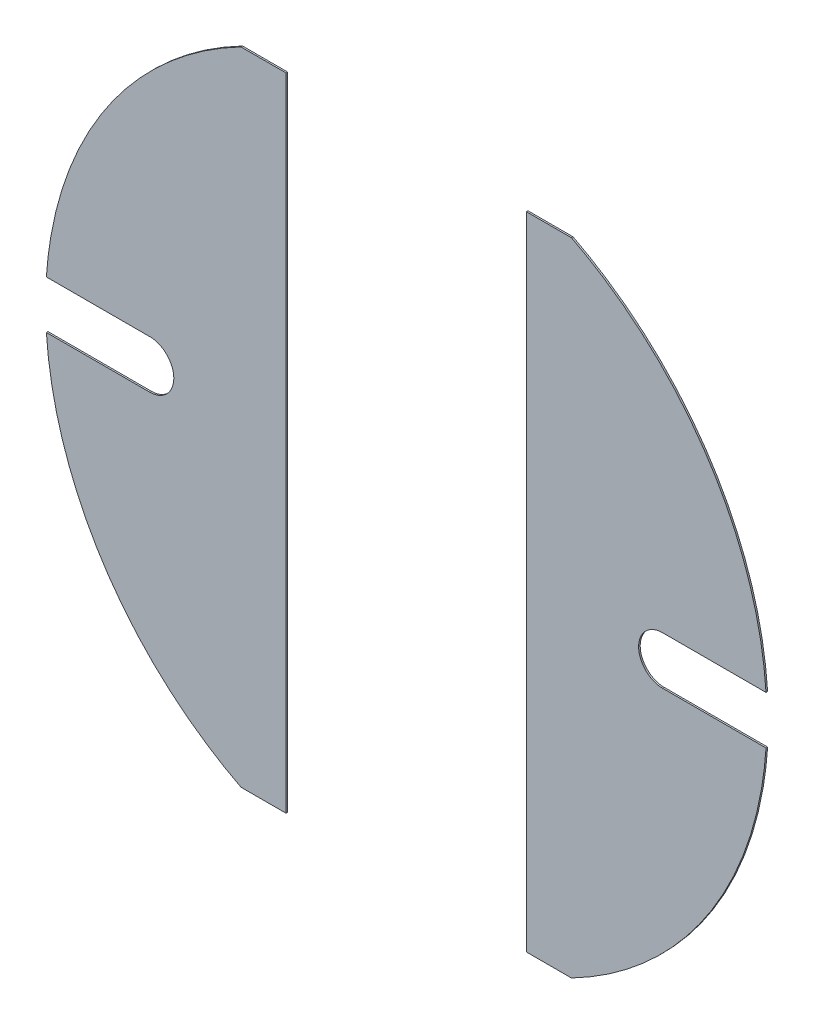
ISO-10303-21;
HEADER;
FILE_DESCRIPTION(('STEP AP214'),'2;1');
FILE_NAME('part.step','',(''),(''),'','','');
FILE_SCHEMA(('AUTOMOTIVE_DESIGN { 1 0 10303 214 1 1 1 1 }'));
ENDSEC;
DATA;
#1=APPLICATION_CONTEXT('core data for automotive mechanical design processes');
#2=APPLICATION_PROTOCOL_DEFINITION('international standard','automotive_design',2000,#1);
#3=PRODUCT_CONTEXT('',#1,'mechanical');
#4=PRODUCT('Part','Part','',(#3));
#5=PRODUCT_RELATED_PRODUCT_CATEGORY('part','',(#4));
#6=PRODUCT_DEFINITION_FORMATION('','',#4);
#7=PRODUCT_DEFINITION_CONTEXT('part definition',#1,'design');
#8=PRODUCT_DEFINITION('design','',#6,#7);
#9=PRODUCT_DEFINITION_SHAPE('','',#8);
#10=(LENGTH_UNIT() NAMED_UNIT(*) SI_UNIT(.MILLI.,.METRE.));
#11=(NAMED_UNIT(*) PLANE_ANGLE_UNIT() SI_UNIT($,.RADIAN.));
#12=(NAMED_UNIT(*) SI_UNIT($,.STERADIAN.) SOLID_ANGLE_UNIT());
#13=UNCERTAINTY_MEASURE_WITH_UNIT(LENGTH_MEASURE(1.E-05),#10,'distance_accuracy_value','');
#14=(GEOMETRIC_REPRESENTATION_CONTEXT(3) GLOBAL_UNCERTAINTY_ASSIGNED_CONTEXT((#13)) GLOBAL_UNIT_ASSIGNED_CONTEXT((#10,
#11,#12)) REPRESENTATION_CONTEXT('',''));
#15=CARTESIAN_POINT('',(0.,0.,0.));
#16=DIRECTION('',(0.,0.,1.));
#17=DIRECTION('',(1.,0.,0.));
#18=AXIS2_PLACEMENT_3D('',#15,#16,#17);
#19=CARTESIAN_POINT('',(0.75,-2.,-0.01));
#20=CARTESIAN_POINT('',(0.75,2.,-0.01));
#21=CARTESIAN_POINT('',(2.244994432064,-2.,-0.01));
#22=CARTESIAN_POINT('',(2.244994432064,2.,-0.01));
#23=(BOUNDED_SURFACE() B_SPLINE_SURFACE(1,1,((#19,#20),(#21,#22)),.UNSPECIFIED.,.F.,.F.,
.F.) B_SPLINE_SURFACE_WITH_KNOTS((2,2),(2,2),(0.75,2.244994432064),(-2.,2.),
.UNSPECIFIED.) GEOMETRIC_REPRESENTATION_ITEM() RATIONAL_B_SPLINE_SURFACE(((1.,1.),(1.,1.))) REPRESENTATION_ITEM('') SURFACE());
#24=CARTESIAN_POINT('',(1.030776406404,-2.,-0.01));
#25=CARTESIAN_POINT('',(0.75,-2.,-0.01));
#26=(BOUNDED_CURVE() B_SPLINE_CURVE(1,(#24,#25),.UNSPECIFIED.,.F.,
.F.) B_SPLINE_CURVE_WITH_KNOTS((2,2),(0.,0.280776406404),
.UNSPECIFIED.) CURVE() GEOMETRIC_REPRESENTATION_ITEM() RATIONAL_B_SPLINE_CURVE((1.,1.)) REPRESENTATION_ITEM(''));
#27=CARTESIAN_POINT('',(1.030776406404,-2.,-0.01));
#28=VERTEX_POINT('',#27);
#29=CARTESIAN_POINT('',(0.75,-2.,-0.01));
#30=VERTEX_POINT('',#29);
#31=EDGE_CURVE('P0_E11',#28,#30,#26,.T.);
#32=CARTESIAN_POINT('',(0.75,-2.,-0.01));
#33=CARTESIAN_POINT('',(0.75,2.,-0.01));
#34=(BOUNDED_CURVE() B_SPLINE_CURVE(1,(#32,#33),.UNSPECIFIED.,.F.,
.F.) B_SPLINE_CURVE_WITH_KNOTS((2,2),(0.,4.),
.UNSPECIFIED.) CURVE() GEOMETRIC_REPRESENTATION_ITEM() RATIONAL_B_SPLINE_CURVE((1.,1.)) REPRESENTATION_ITEM(''));
#35=CARTESIAN_POINT('',(0.75,2.,-0.01));
#36=VERTEX_POINT('',#35);
#37=EDGE_CURVE('P0_E149',#30,#36,#34,.T.);
#38=CARTESIAN_POINT('',(1.030776406404,2.,-0.01));
#39=CARTESIAN_POINT('',(0.75,2.,-0.01));
#40=(BOUNDED_CURVE() B_SPLINE_CURVE(1,(#38,#39),.UNSPECIFIED.,.F.,
.F.) B_SPLINE_CURVE_WITH_KNOTS((2,2),(0.,0.280776406404),
.UNSPECIFIED.) CURVE() GEOMETRIC_REPRESENTATION_ITEM() RATIONAL_B_SPLINE_CURVE((1.,1.)) REPRESENTATION_ITEM(''));
#41=CARTESIAN_POINT('',(1.030776406404,2.,-0.01));
#42=VERTEX_POINT('',#41);
#43=EDGE_CURVE('P0_E190',#42,#36,#40,.T.);
#44=CARTESIAN_POINT('',(2.244994432064,0.15,-0.01));
#45=CARTESIAN_POINT('',(2.160281546553,1.417866375311,-0.01));
#46=CARTESIAN_POINT('',(1.030776406404,2.,-0.01));
#47=(BOUNDED_CURVE() B_SPLINE_CURVE(2,(#44,#45,#46),.UNSPECIFIED.,.F.,
.F.) B_SPLINE_CURVE_WITH_KNOTS((3,3),(4.779105128795,5.807303057519),
.UNSPECIFIED.) CURVE() GEOMETRIC_REPRESENTATION_ITEM() RATIONAL_B_SPLINE_CURVE((1.,
0.87073616041,1.)) REPRESENTATION_ITEM(''));
#48=CARTESIAN_POINT('',(2.244994432064,0.15,-0.01));
#49=VERTEX_POINT('',#48);
#50=EDGE_CURVE('P0_E97',#49,#42,#47,.T.);
#51=CARTESIAN_POINT('',(2.244994432064,0.15,-0.01));
#52=CARTESIAN_POINT('',(1.6,0.15,-0.01));
#53=(BOUNDED_CURVE() B_SPLINE_CURVE(1,(#51,#52),.UNSPECIFIED.,.F.,
.F.) B_SPLINE_CURVE_WITH_KNOTS((2,2),(0.,0.644994432064),
.UNSPECIFIED.) CURVE() GEOMETRIC_REPRESENTATION_ITEM() RATIONAL_B_SPLINE_CURVE((1.,1.)) REPRESENTATION_ITEM(''));
#54=CARTESIAN_POINT('',(1.6,0.15,-0.01));
#55=VERTEX_POINT('',#54);
#56=EDGE_CURVE('P0_E90',#49,#55,#53,.T.);
#57=CARTESIAN_POINT('',(1.6,0.15,-0.01));
#58=CARTESIAN_POINT('',(1.45,0.15,-0.01));
#59=CARTESIAN_POINT('',(1.45,0.,-0.01));
#60=CARTESIAN_POINT('',(1.45,-0.15,-0.01));
#61=CARTESIAN_POINT('',(1.6,-0.15,-0.01));
#62=(BOUNDED_CURVE() B_SPLINE_CURVE(2,(#57,#58,#59,#60,#61),.UNSPECIFIED.,.F.,
.F.) B_SPLINE_CURVE_WITH_KNOTS((3,2,3),(0.,1.570796326795,3.14159265359),
.UNSPECIFIED.) CURVE() GEOMETRIC_REPRESENTATION_ITEM() RATIONAL_B_SPLINE_CURVE((1.,
0.707106781187,1.,0.707106781187,1.)) REPRESENTATION_ITEM(''));
#63=CARTESIAN_POINT('',(1.6,-0.15,-0.01));
#64=VERTEX_POINT('',#63);
#65=EDGE_CURVE('P0_E93',#55,#64,#62,.T.);
#66=CARTESIAN_POINT('',(2.244994432064,-0.15,-0.01));
#67=CARTESIAN_POINT('',(1.6,-0.15,-0.01));
#68=(BOUNDED_CURVE() B_SPLINE_CURVE(1,(#66,#67),.UNSPECIFIED.,.F.,
.F.) B_SPLINE_CURVE_WITH_KNOTS((2,2),(0.,0.644994432064),
.UNSPECIFIED.) CURVE() GEOMETRIC_REPRESENTATION_ITEM() RATIONAL_B_SPLINE_CURVE((1.,1.)) REPRESENTATION_ITEM(''));
#69=CARTESIAN_POINT('',(2.244994432064,-0.15,-0.01));
#70=VERTEX_POINT('',#69);
#71=EDGE_CURVE('P0_E164',#70,#64,#68,.T.);
#72=CARTESIAN_POINT('',(1.030776406404,-2.,-0.01));
#73=CARTESIAN_POINT('',(2.160281546553,-1.417866375311,-0.01));
#74=CARTESIAN_POINT('',(2.244994432064,-0.15,-0.01));
#75=(BOUNDED_CURVE() B_SPLINE_CURVE(2,(#72,#73,#74),.UNSPECIFIED.,.F.,
.F.) B_SPLINE_CURVE_WITH_KNOTS((3,3),(3.61747490325,4.645672831974),
.UNSPECIFIED.) CURVE() GEOMETRIC_REPRESENTATION_ITEM() RATIONAL_B_SPLINE_CURVE((1.,
0.87073616041,1.)) REPRESENTATION_ITEM(''));
#76=EDGE_CURVE('P0_E131',#28,#70,#75,.T.);
#77=ORIENTED_EDGE('',*,*,#31,.T.);
#78=ORIENTED_EDGE('',*,*,#37,.T.);
#79=ORIENTED_EDGE('',*,*,#43,.F.);
#80=ORIENTED_EDGE('',*,*,#50,.F.);
#81=ORIENTED_EDGE('',*,*,#56,.T.);
#82=ORIENTED_EDGE('',*,*,#65,.T.);
#83=ORIENTED_EDGE('',*,*,#71,.F.);
#84=ORIENTED_EDGE('',*,*,#76,.F.);
#85=EDGE_LOOP('',(#77,#78,#79,#80,#81,#82,#83,#84));
#86=FACE_BOUND('',#85,.T.);
#87=ADVANCED_FACE('P0_F17',(#86),#23,.F.);
#88=CARTESIAN_POINT('',(0.75,-2.,0.));
#89=CARTESIAN_POINT('',(0.75,2.,0.));
#90=CARTESIAN_POINT('',(2.244994432064,-2.,0.));
#91=CARTESIAN_POINT('',(2.244994432064,2.,0.));
#92=(BOUNDED_SURFACE() B_SPLINE_SURFACE(1,1,((#88,#89),(#90,#91)),.UNSPECIFIED.,.F.,.F.,
.F.) B_SPLINE_SURFACE_WITH_KNOTS((2,2),(2,2),(0.75,2.244994432064),(-2.,2.),
.UNSPECIFIED.) GEOMETRIC_REPRESENTATION_ITEM() RATIONAL_B_SPLINE_SURFACE(((1.,1.),(1.,1.))) REPRESENTATION_ITEM('') SURFACE());
#93=CARTESIAN_POINT('',(1.030776406404,-2.,0.));
#94=CARTESIAN_POINT('',(2.160281546553,-1.417866375311,0.));
#95=CARTESIAN_POINT('',(2.244994432064,-0.15,0.));
#96=(BOUNDED_CURVE() B_SPLINE_CURVE(2,(#93,#94,#95),.UNSPECIFIED.,.F.,
.F.) B_SPLINE_CURVE_WITH_KNOTS((3,3),(3.61747490325,4.645672831974),
.UNSPECIFIED.) CURVE() GEOMETRIC_REPRESENTATION_ITEM() RATIONAL_B_SPLINE_CURVE((1.,
0.87073616041,1.)) REPRESENTATION_ITEM(''));
#97=CARTESIAN_POINT('',(1.030776406404,-2.,0.));
#98=VERTEX_POINT('',#97);
#99=CARTESIAN_POINT('',(2.244994432064,-0.15,0.));
#100=VERTEX_POINT('',#99);
#101=EDGE_CURVE('P0_E172',#98,#100,#96,.T.);
#102=CARTESIAN_POINT('',(2.244994432064,-0.15,0.));
#103=CARTESIAN_POINT('',(1.6,-0.15,0.));
#104=(BOUNDED_CURVE() B_SPLINE_CURVE(1,(#102,#103),.UNSPECIFIED.,.F.,
.F.) B_SPLINE_CURVE_WITH_KNOTS((2,2),(0.,0.644994432064),
.UNSPECIFIED.) CURVE() GEOMETRIC_REPRESENTATION_ITEM() RATIONAL_B_SPLINE_CURVE((1.,1.)) REPRESENTATION_ITEM(''));
#105=CARTESIAN_POINT('',(1.6,-0.15,0.));
#106=VERTEX_POINT('',#105);
#107=EDGE_CURVE('P0_E125',#100,#106,#104,.T.);
#108=CARTESIAN_POINT('',(1.6,0.15,0.));
#109=CARTESIAN_POINT('',(1.45,0.15,0.));
#110=CARTESIAN_POINT('',(1.45,0.,0.));
#111=CARTESIAN_POINT('',(1.45,-0.15,0.));
#112=CARTESIAN_POINT('',(1.6,-0.15,0.));
#113=(BOUNDED_CURVE() B_SPLINE_CURVE(2,(#108,#109,#110,#111,#112),.UNSPECIFIED.,.F.,
.F.) B_SPLINE_CURVE_WITH_KNOTS((3,2,3),(0.,1.570796326795,3.14159265359),
.UNSPECIFIED.) CURVE() GEOMETRIC_REPRESENTATION_ITEM() RATIONAL_B_SPLINE_CURVE((1.,
0.707106781187,1.,0.707106781187,1.)) REPRESENTATION_ITEM(''));
#114=CARTESIAN_POINT('',(1.6,0.15,0.));
#115=VERTEX_POINT('',#114);
#116=EDGE_CURVE('P0_E119',#115,#106,#113,.T.);
#117=CARTESIAN_POINT('',(2.244994432064,0.15,0.));
#118=CARTESIAN_POINT('',(1.6,0.15,0.));
#119=(BOUNDED_CURVE() B_SPLINE_CURVE(1,(#117,#118),.UNSPECIFIED.,.F.,
.F.) B_SPLINE_CURVE_WITH_KNOTS((2,2),(0.,0.644994432064),
.UNSPECIFIED.) CURVE() GEOMETRIC_REPRESENTATION_ITEM() RATIONAL_B_SPLINE_CURVE((1.,1.)) REPRESENTATION_ITEM(''));
#120=CARTESIAN_POINT('',(2.244994432064,0.15,0.));
#121=VERTEX_POINT('',#120);
#122=EDGE_CURVE('P0_E103',#121,#115,#119,.T.);
#123=CARTESIAN_POINT('',(2.244994432064,0.15,0.));
#124=CARTESIAN_POINT('',(2.160281546553,1.417866375311,0.));
#125=CARTESIAN_POINT('',(1.030776406404,2.,0.));
#126=(BOUNDED_CURVE() B_SPLINE_CURVE(2,(#123,#124,#125),.UNSPECIFIED.,.F.,
.F.) B_SPLINE_CURVE_WITH_KNOTS((3,3),(4.779105128795,5.807303057519),
.UNSPECIFIED.) CURVE() GEOMETRIC_REPRESENTATION_ITEM() RATIONAL_B_SPLINE_CURVE((1.,
0.87073616041,1.)) REPRESENTATION_ITEM(''));
#127=CARTESIAN_POINT('',(1.030776406404,2.,0.));
#128=VERTEX_POINT('',#127);
#129=EDGE_CURVE('P0_E181',#121,#128,#126,.T.);
#130=CARTESIAN_POINT('',(1.030776406404,2.,0.));
#131=CARTESIAN_POINT('',(0.75,2.,0.));
#132=(BOUNDED_CURVE() B_SPLINE_CURVE(1,(#130,#131),.UNSPECIFIED.,.F.,
.F.) B_SPLINE_CURVE_WITH_KNOTS((2,2),(0.,0.280776406404),
.UNSPECIFIED.) CURVE() GEOMETRIC_REPRESENTATION_ITEM() RATIONAL_B_SPLINE_CURVE((1.,1.)) REPRESENTATION_ITEM(''));
#133=CARTESIAN_POINT('',(0.75,2.,0.));
#134=VERTEX_POINT('',#133);
#135=EDGE_CURVE('P0_E150',#128,#134,#132,.T.);
#136=CARTESIAN_POINT('',(0.75,-2.,0.));
#137=CARTESIAN_POINT('',(0.75,2.,0.));
#138=(BOUNDED_CURVE() B_SPLINE_CURVE(1,(#136,#137),.UNSPECIFIED.,.F.,
.F.) B_SPLINE_CURVE_WITH_KNOTS((2,2),(0.,4.),
.UNSPECIFIED.) CURVE() GEOMETRIC_REPRESENTATION_ITEM() RATIONAL_B_SPLINE_CURVE((1.,1.)) REPRESENTATION_ITEM(''));
#139=CARTESIAN_POINT('',(0.75,-2.,0.));
#140=VERTEX_POINT('',#139);
#141=EDGE_CURVE('P0_E141',#140,#134,#138,.T.);
#142=CARTESIAN_POINT('',(1.030776406404,-2.,0.));
#143=CARTESIAN_POINT('',(0.75,-2.,0.));
#144=(BOUNDED_CURVE() B_SPLINE_CURVE(1,(#142,#143),.UNSPECIFIED.,.F.,
.F.) B_SPLINE_CURVE_WITH_KNOTS((2,2),(0.,0.280776406404),
.UNSPECIFIED.) CURVE() GEOMETRIC_REPRESENTATION_ITEM() RATIONAL_B_SPLINE_CURVE((1.,1.)) REPRESENTATION_ITEM(''));
#145=EDGE_CURVE('P0_E32',#98,#140,#144,.T.);
#146=ORIENTED_EDGE('',*,*,#101,.T.);
#147=ORIENTED_EDGE('',*,*,#107,.T.);
#148=ORIENTED_EDGE('',*,*,#116,.F.);
#149=ORIENTED_EDGE('',*,*,#122,.F.);
#150=ORIENTED_EDGE('',*,*,#129,.T.);
#151=ORIENTED_EDGE('',*,*,#135,.T.);
#152=ORIENTED_EDGE('',*,*,#141,.F.);
#153=ORIENTED_EDGE('',*,*,#145,.F.);
#154=EDGE_LOOP('',(#146,#147,#148,#149,#150,#151,#152,#153));
#155=FACE_BOUND('',#154,.T.);
#156=ADVANCED_FACE('P0_F295',(#155),#92,.T.);
#157=CARTESIAN_POINT('',(1.030776406404,-2.,-0.01));
#158=CARTESIAN_POINT('',(1.030776406404,-2.,0.));
#159=CARTESIAN_POINT('',(0.75,-2.,-0.01));
#160=CARTESIAN_POINT('',(0.75,-2.,0.));
#161=(BOUNDED_SURFACE() B_SPLINE_SURFACE(1,1,((#157,#158),(#159,#160)),.UNSPECIFIED.,.F.,.F.,
.F.) B_SPLINE_SURFACE_WITH_KNOTS((2,2),(2,2),(0.,0.280776406404),(-0.01,0.),
.UNSPECIFIED.) GEOMETRIC_REPRESENTATION_ITEM() RATIONAL_B_SPLINE_SURFACE(((1.,1.),(1.,1.))) REPRESENTATION_ITEM('') SURFACE());
#162=CARTESIAN_POINT('',(0.75,-2.,0.));
#163=CARTESIAN_POINT('',(0.75,-2.,-0.01));
#164=(BOUNDED_CURVE() B_SPLINE_CURVE(1,(#162,#163),.UNSPECIFIED.,.F.,
.F.) B_SPLINE_CURVE_WITH_KNOTS((2,2),(0.,0.01),
.UNSPECIFIED.) CURVE() GEOMETRIC_REPRESENTATION_ITEM() RATIONAL_B_SPLINE_CURVE((1.,1.)) REPRESENTATION_ITEM(''));
#165=EDGE_CURVE('P0_E157',#140,#30,#164,.T.);
#166=CARTESIAN_POINT('',(1.030776406404,-2.,0.));
#167=CARTESIAN_POINT('',(1.030776406404,-2.,-0.01));
#168=(BOUNDED_CURVE() B_SPLINE_CURVE(1,(#166,#167),.UNSPECIFIED.,.F.,
.F.) B_SPLINE_CURVE_WITH_KNOTS((2,2),(0.,0.01),
.UNSPECIFIED.) CURVE() GEOMETRIC_REPRESENTATION_ITEM() RATIONAL_B_SPLINE_CURVE((1.,1.)) REPRESENTATION_ITEM(''));
#169=EDGE_CURVE('P0_E272',#98,#28,#168,.T.);
#170=ORIENTED_EDGE('',*,*,#145,.T.);
#171=ORIENTED_EDGE('',*,*,#165,.T.);
#172=ORIENTED_EDGE('',*,*,#31,.F.);
#173=ORIENTED_EDGE('',*,*,#169,.F.);
#174=EDGE_LOOP('',(#170,#171,#172,#173));
#175=FACE_BOUND('',#174,.T.);
#176=ADVANCED_FACE('P0_F299',(#175),#161,.F.);
#177=CARTESIAN_POINT('',(0.75,-2.,-0.01));
#178=CARTESIAN_POINT('',(0.75,-2.,0.));
#179=CARTESIAN_POINT('',(0.75,2.,-0.01));
#180=CARTESIAN_POINT('',(0.75,2.,0.));
#181=(BOUNDED_SURFACE() B_SPLINE_SURFACE(1,1,((#177,#178),(#179,#180)),.UNSPECIFIED.,.F.,.F.,
.F.) B_SPLINE_SURFACE_WITH_KNOTS((2,2),(2,2),(0.,4.),(-0.01,0.),
.UNSPECIFIED.) GEOMETRIC_REPRESENTATION_ITEM() RATIONAL_B_SPLINE_SURFACE(((1.,1.),(1.,1.))) REPRESENTATION_ITEM('') SURFACE());
#182=CARTESIAN_POINT('',(0.75,2.,0.));
#183=CARTESIAN_POINT('',(0.75,2.,-0.01));
#184=(BOUNDED_CURVE() B_SPLINE_CURVE(1,(#182,#183),.UNSPECIFIED.,.F.,
.F.) B_SPLINE_CURVE_WITH_KNOTS((2,2),(0.,0.01),
.UNSPECIFIED.) CURVE() GEOMETRIC_REPRESENTATION_ITEM() RATIONAL_B_SPLINE_CURVE((1.,1.)) REPRESENTATION_ITEM(''));
#185=EDGE_CURVE('P0_E221',#134,#36,#184,.T.);
#186=ORIENTED_EDGE('',*,*,#141,.T.);
#187=ORIENTED_EDGE('',*,*,#185,.T.);
#188=ORIENTED_EDGE('',*,*,#37,.F.);
#189=ORIENTED_EDGE('',*,*,#165,.F.);
#190=EDGE_LOOP('',(#186,#187,#188,#189));
#191=FACE_BOUND('',#190,.T.);
#192=ADVANCED_FACE('P0_F301',(#191),#181,.F.);
#193=CARTESIAN_POINT('',(1.030776406404,2.,-0.01));
#194=CARTESIAN_POINT('',(1.030776406404,2.,0.));
#195=CARTESIAN_POINT('',(0.75,2.,-0.01));
#196=CARTESIAN_POINT('',(0.75,2.,0.));
#197=(BOUNDED_SURFACE() B_SPLINE_SURFACE(1,1,((#193,#194),(#195,#196)),.UNSPECIFIED.,.F.,.F.,
.F.) B_SPLINE_SURFACE_WITH_KNOTS((2,2),(2,2),(0.,0.280776406404),(-0.01,0.),
.UNSPECIFIED.) GEOMETRIC_REPRESENTATION_ITEM() RATIONAL_B_SPLINE_SURFACE(((1.,1.),(1.,1.))) REPRESENTATION_ITEM('') SURFACE());
#198=CARTESIAN_POINT('',(1.030776406404,2.,0.));
#199=CARTESIAN_POINT('',(1.030776406404,2.,-0.01));
#200=(BOUNDED_CURVE() B_SPLINE_CURVE(1,(#198,#199),.UNSPECIFIED.,.F.,
.F.) B_SPLINE_CURVE_WITH_KNOTS((2,2),(0.,0.01),
.UNSPECIFIED.) CURVE() GEOMETRIC_REPRESENTATION_ITEM() RATIONAL_B_SPLINE_CURVE((1.,1.)) REPRESENTATION_ITEM(''));
#201=EDGE_CURVE('P0_E23',#128,#42,#200,.T.);
#202=ORIENTED_EDGE('',*,*,#201,.T.);
#203=ORIENTED_EDGE('',*,*,#43,.T.);
#204=ORIENTED_EDGE('',*,*,#185,.F.);
#205=ORIENTED_EDGE('',*,*,#135,.F.);
#206=EDGE_LOOP('',(#202,#203,#204,#205));
#207=FACE_BOUND('',#206,.T.);
#208=ADVANCED_FACE('P0_F306',(#207),#197,.T.);
#209=CARTESIAN_POINT('',(2.244994432064,0.15,-0.01));
#210=CARTESIAN_POINT('',(2.244994432064,0.15,0.));
#211=CARTESIAN_POINT('',(2.160281546553,1.417866375311,-0.01));
#212=CARTESIAN_POINT('',(2.160281546553,1.417866375311,0.));
#213=CARTESIAN_POINT('',(1.030776406404,2.,-0.01));
#214=CARTESIAN_POINT('',(1.030776406404,2.,0.));
#215=(BOUNDED_SURFACE() B_SPLINE_SURFACE(2,1,((#209,#210),(#211,#212),(#213,#214)),
.UNSPECIFIED.,.F.,.F.,.F.) B_SPLINE_SURFACE_WITH_KNOTS((3,3),(2,2),(4.779105128795,
5.807303057519),(-0.01,0.),
.UNSPECIFIED.) GEOMETRIC_REPRESENTATION_ITEM() RATIONAL_B_SPLINE_SURFACE(((1.,1.),
(0.87073616041,0.87073616041),(1.,1.))) REPRESENTATION_ITEM('') SURFACE());
#216=CARTESIAN_POINT('',(2.244994432064,0.15,0.));
#217=CARTESIAN_POINT('',(2.244994432064,0.15,-0.01));
#218=(BOUNDED_CURVE() B_SPLINE_CURVE(1,(#216,#217),.UNSPECIFIED.,.F.,
.F.) B_SPLINE_CURVE_WITH_KNOTS((2,2),(0.,0.01),
.UNSPECIFIED.) CURVE() GEOMETRIC_REPRESENTATION_ITEM() RATIONAL_B_SPLINE_CURVE((1.,1.)) REPRESENTATION_ITEM(''));
#219=EDGE_CURVE('P0_E102',#121,#49,#218,.T.);
#220=ORIENTED_EDGE('',*,*,#219,.T.);
#221=ORIENTED_EDGE('',*,*,#50,.T.);
#222=ORIENTED_EDGE('',*,*,#201,.F.);
#223=ORIENTED_EDGE('',*,*,#129,.F.);
#224=EDGE_LOOP('',(#220,#221,#222,#223));
#225=FACE_BOUND('',#224,.T.);
#226=ADVANCED_FACE('P0_F19',(#225),#215,.T.);
#227=CARTESIAN_POINT('',(2.244994432064,0.15,-0.01));
#228=CARTESIAN_POINT('',(2.244994432064,0.15,0.));
#229=CARTESIAN_POINT('',(1.6,0.15,-0.01));
#230=CARTESIAN_POINT('',(1.6,0.15,0.));
#231=(BOUNDED_SURFACE() B_SPLINE_SURFACE(1,1,((#227,#228),(#229,#230)),.UNSPECIFIED.,.F.,.F.,
.F.) B_SPLINE_SURFACE_WITH_KNOTS((2,2),(2,2),(0.,0.644994432064),(-0.01,0.),
.UNSPECIFIED.) GEOMETRIC_REPRESENTATION_ITEM() RATIONAL_B_SPLINE_SURFACE(((1.,1.),(1.,1.))) REPRESENTATION_ITEM('') SURFACE());
#232=CARTESIAN_POINT('',(1.6,0.15,0.));
#233=CARTESIAN_POINT('',(1.6,0.15,-0.01));
#234=(BOUNDED_CURVE() B_SPLINE_CURVE(1,(#232,#233),.UNSPECIFIED.,.F.,
.F.) B_SPLINE_CURVE_WITH_KNOTS((2,2),(0.,0.01),
.UNSPECIFIED.) CURVE() GEOMETRIC_REPRESENTATION_ITEM() RATIONAL_B_SPLINE_CURVE((1.,1.)) REPRESENTATION_ITEM(''));
#235=EDGE_CURVE('P0_E106',#115,#55,#234,.T.);
#236=ORIENTED_EDGE('',*,*,#122,.T.);
#237=ORIENTED_EDGE('',*,*,#235,.T.);
#238=ORIENTED_EDGE('',*,*,#56,.F.);
#239=ORIENTED_EDGE('',*,*,#219,.F.);
#240=EDGE_LOOP('',(#236,#237,#238,#239));
#241=FACE_BOUND('',#240,.T.);
#242=ADVANCED_FACE('P0_F107',(#241),#231,.F.);
#243=CARTESIAN_POINT('',(1.6,0.15,-0.01));
#244=CARTESIAN_POINT('',(1.6,0.15,0.));
#245=CARTESIAN_POINT('',(1.45,0.15,-0.01));
#246=CARTESIAN_POINT('',(1.45,0.15,0.));
#247=CARTESIAN_POINT('',(1.45,0.,-0.01));
#248=CARTESIAN_POINT('',(1.45,0.,0.));
#249=CARTESIAN_POINT('',(1.45,-0.15,-0.01));
#250=CARTESIAN_POINT('',(1.45,-0.15,0.));
#251=CARTESIAN_POINT('',(1.6,-0.15,-0.01));
#252=CARTESIAN_POINT('',(1.6,-0.15,0.));
#253=(BOUNDED_SURFACE() B_SPLINE_SURFACE(2,1,((#243,#244),(#245,#246),(#247,#248),(#249,#250),
(#251,#252)),.UNSPECIFIED.,.F.,.F.,.F.) B_SPLINE_SURFACE_WITH_KNOTS((3,2,3),(2,2),(0.,
1.570796326795,3.14159265359),(-0.01,0.),
.UNSPECIFIED.) GEOMETRIC_REPRESENTATION_ITEM() RATIONAL_B_SPLINE_SURFACE(((1.,1.),
(0.707106781187,0.707106781187),(1.,1.),(0.707106781187,0.707106781187),(1.,1.))) REPRESENTATION_ITEM('') SURFACE());
#254=CARTESIAN_POINT('',(1.6,-0.15,0.));
#255=CARTESIAN_POINT('',(1.6,-0.15,-0.01));
#256=(BOUNDED_CURVE() B_SPLINE_CURVE(1,(#254,#255),.UNSPECIFIED.,.F.,
.F.) B_SPLINE_CURVE_WITH_KNOTS((2,2),(0.,0.01),
.UNSPECIFIED.) CURVE() GEOMETRIC_REPRESENTATION_ITEM() RATIONAL_B_SPLINE_CURVE((1.,1.)) REPRESENTATION_ITEM(''));
#257=EDGE_CURVE('P0_E116',#106,#64,#256,.T.);
#258=ORIENTED_EDGE('',*,*,#116,.T.);
#259=ORIENTED_EDGE('',*,*,#257,.T.);
#260=ORIENTED_EDGE('',*,*,#65,.F.);
#261=ORIENTED_EDGE('',*,*,#235,.F.);
#262=EDGE_LOOP('',(#258,#259,#260,#261));
#263=FACE_BOUND('',#262,.T.);
#264=ADVANCED_FACE('P0_F114',(#263),#253,.F.);
#265=CARTESIAN_POINT('',(2.244994432064,-0.15,-0.01));
#266=CARTESIAN_POINT('',(2.244994432064,-0.15,0.));
#267=CARTESIAN_POINT('',(1.6,-0.15,-0.01));
#268=CARTESIAN_POINT('',(1.6,-0.15,0.));
#269=(BOUNDED_SURFACE() B_SPLINE_SURFACE(1,1,((#265,#266),(#267,#268)),.UNSPECIFIED.,.F.,.F.,
.F.) B_SPLINE_SURFACE_WITH_KNOTS((2,2),(2,2),(0.,0.644994432064),(-0.01,0.),
.UNSPECIFIED.) GEOMETRIC_REPRESENTATION_ITEM() RATIONAL_B_SPLINE_SURFACE(((1.,1.),(1.,1.))) REPRESENTATION_ITEM('') SURFACE());
#270=CARTESIAN_POINT('',(2.244994432064,-0.15,0.));
#271=CARTESIAN_POINT('',(2.244994432064,-0.15,-0.01));
#272=(BOUNDED_CURVE() B_SPLINE_CURVE(1,(#270,#271),.UNSPECIFIED.,.F.,
.F.) B_SPLINE_CURVE_WITH_KNOTS((2,2),(0.,0.01),
.UNSPECIFIED.) CURVE() GEOMETRIC_REPRESENTATION_ITEM() RATIONAL_B_SPLINE_CURVE((1.,1.)) REPRESENTATION_ITEM(''));
#273=EDGE_CURVE('P0_E206',#100,#70,#272,.T.);
#274=ORIENTED_EDGE('',*,*,#273,.T.);
#275=ORIENTED_EDGE('',*,*,#71,.T.);
#276=ORIENTED_EDGE('',*,*,#257,.F.);
#277=ORIENTED_EDGE('',*,*,#107,.F.);
#278=EDGE_LOOP('',(#274,#275,#276,#277));
#279=FACE_BOUND('',#278,.T.);
#280=ADVANCED_FACE('P0_F292',(#279),#269,.T.);
#281=CARTESIAN_POINT('',(1.030776406404,-2.,-0.01));
#282=CARTESIAN_POINT('',(1.030776406404,-2.,0.));
#283=CARTESIAN_POINT('',(2.160281546553,-1.417866375311,-0.01));
#284=CARTESIAN_POINT('',(2.160281546553,-1.417866375311,0.));
#285=CARTESIAN_POINT('',(2.244994432064,-0.15,-0.01));
#286=CARTESIAN_POINT('',(2.244994432064,-0.15,0.));
#287=(BOUNDED_SURFACE() B_SPLINE_SURFACE(2,1,((#281,#282),(#283,#284),(#285,#286)),
.UNSPECIFIED.,.F.,.F.,.F.) B_SPLINE_SURFACE_WITH_KNOTS((3,3),(2,2),(3.61747490325,
4.645672831974),(-0.01,0.),
.UNSPECIFIED.) GEOMETRIC_REPRESENTATION_ITEM() RATIONAL_B_SPLINE_SURFACE(((1.,1.),
(0.87073616041,0.87073616041),(1.,1.))) REPRESENTATION_ITEM('') SURFACE());
#288=ORIENTED_EDGE('',*,*,#169,.T.);
#289=ORIENTED_EDGE('',*,*,#76,.T.);
#290=ORIENTED_EDGE('',*,*,#273,.F.);
#291=ORIENTED_EDGE('',*,*,#101,.F.);
#292=EDGE_LOOP('',(#288,#289,#290,#291));
#293=FACE_BOUND('',#292,.T.);
#294=ADVANCED_FACE('P0_F290',(#293),#287,.T.);
#295=CLOSED_SHELL('',(#87,#156,#176,#192,#208,#226,#242,#264,#280,#294));
#296=MANIFOLD_SOLID_BREP('P0_B1',#295);
#297=CARTESIAN_POINT('',(-2.244994432064,-2.,-0.01));
#298=CARTESIAN_POINT('',(-2.244994432064,2.,-0.01));
#299=CARTESIAN_POINT('',(-0.75,-2.,-0.01));
#300=CARTESIAN_POINT('',(-0.75,2.,-0.01));
#301=(BOUNDED_SURFACE() B_SPLINE_SURFACE(1,1,((#297,#298),(#299,#300)),.UNSPECIFIED.,.F.,.F.,
.F.) B_SPLINE_SURFACE_WITH_KNOTS((2,2),(2,2),(-2.244994432064,-0.75),(-2.,2.),
.UNSPECIFIED.) GEOMETRIC_REPRESENTATION_ITEM() RATIONAL_B_SPLINE_SURFACE(((1.,1.),(1.,1.))) REPRESENTATION_ITEM('') SURFACE());
#302=CARTESIAN_POINT('',(-1.6,-0.15,-0.01));
#303=CARTESIAN_POINT('',(-1.45,-0.15,-0.01));
#304=CARTESIAN_POINT('',(-1.45,0.,-0.01));
#305=CARTESIAN_POINT('',(-1.45,0.15,-0.01));
#306=CARTESIAN_POINT('',(-1.6,0.15,-0.01));
#307=(BOUNDED_CURVE() B_SPLINE_CURVE(2,(#302,#303,#304,#305,#306),.UNSPECIFIED.,.F.,
.F.) B_SPLINE_CURVE_WITH_KNOTS((3,2,3),(3.14159265359,4.712388980385,6.28318530718),
.UNSPECIFIED.) CURVE() GEOMETRIC_REPRESENTATION_ITEM() RATIONAL_B_SPLINE_CURVE((1.,
0.707106781187,1.,0.707106781187,1.)) REPRESENTATION_ITEM(''));
#308=CARTESIAN_POINT('',(-1.6,-0.15,-0.01));
#309=VERTEX_POINT('',#308);
#310=CARTESIAN_POINT('',(-1.6,0.15,-0.01));
#311=VERTEX_POINT('',#310);
#312=EDGE_CURVE('P1_E11',#309,#311,#307,.T.);
#313=CARTESIAN_POINT('',(-2.244994432064,0.15,-0.01));
#314=CARTESIAN_POINT('',(-1.6,0.15,-0.01));
#315=(BOUNDED_CURVE() B_SPLINE_CURVE(1,(#313,#314),.UNSPECIFIED.,.F.,
.F.) B_SPLINE_CURVE_WITH_KNOTS((2,2),(0.,0.644994432064),
.UNSPECIFIED.) CURVE() GEOMETRIC_REPRESENTATION_ITEM() RATIONAL_B_SPLINE_CURVE((1.,1.)) REPRESENTATION_ITEM(''));
#316=CARTESIAN_POINT('',(-2.244994432064,0.15,-0.01));
#317=VERTEX_POINT('',#316);
#318=EDGE_CURVE('P1_E198',#317,#311,#315,.T.);
#319=CARTESIAN_POINT('',(-1.030776406404,2.,-0.01));
#320=CARTESIAN_POINT('',(-2.160281546553,1.417866375311,-0.01));
#321=CARTESIAN_POINT('',(-2.244994432064,0.15,-0.01));
#322=(BOUNDED_CURVE() B_SPLINE_CURVE(2,(#319,#320,#321),.UNSPECIFIED.,.F.,
.F.) B_SPLINE_CURVE_WITH_KNOTS((3,3),(0.47588224966,1.504080178385),
.UNSPECIFIED.) CURVE() GEOMETRIC_REPRESENTATION_ITEM() RATIONAL_B_SPLINE_CURVE((1.,
0.87073616041,1.)) REPRESENTATION_ITEM(''));
#323=CARTESIAN_POINT('',(-1.030776406404,2.,-0.01));
#324=VERTEX_POINT('',#323);
#325=EDGE_CURVE('P1_E165',#324,#317,#322,.T.);
#326=CARTESIAN_POINT('',(-1.030776406404,2.,-0.01));
#327=CARTESIAN_POINT('',(-0.75,2.,-0.01));
#328=(BOUNDED_CURVE() B_SPLINE_CURVE(1,(#326,#327),.UNSPECIFIED.,.F.,
.F.) B_SPLINE_CURVE_WITH_KNOTS((2,2),(0.,0.280776406404),
.UNSPECIFIED.) CURVE() GEOMETRIC_REPRESENTATION_ITEM() RATIONAL_B_SPLINE_CURVE((1.,1.)) REPRESENTATION_ITEM(''));
#329=CARTESIAN_POINT('',(-0.75,2.,-0.01));
#330=VERTEX_POINT('',#329);
#331=EDGE_CURVE('P1_E176',#324,#330,#328,.T.);
#332=CARTESIAN_POINT('',(-0.75,-2.,-0.01));
#333=CARTESIAN_POINT('',(-0.75,2.,-0.01));
#334=(BOUNDED_CURVE() B_SPLINE_CURVE(1,(#332,#333),.UNSPECIFIED.,.F.,
.F.) B_SPLINE_CURVE_WITH_KNOTS((2,2),(0.,4.),
.UNSPECIFIED.) CURVE() GEOMETRIC_REPRESENTATION_ITEM() RATIONAL_B_SPLINE_CURVE((1.,1.)) REPRESENTATION_ITEM(''));
#335=CARTESIAN_POINT('',(-0.75,-2.,-0.01));
#336=VERTEX_POINT('',#335);
#337=EDGE_CURVE('P1_E123',#336,#330,#334,.T.);
#338=CARTESIAN_POINT('',(-0.75,-2.,-0.01));
#339=CARTESIAN_POINT('',(-1.030776406404,-2.,-0.01));
#340=(BOUNDED_CURVE() B_SPLINE_CURVE(1,(#338,#339),.UNSPECIFIED.,.F.,
.F.) B_SPLINE_CURVE_WITH_KNOTS((2,2),(0.,0.280776406404),
.UNSPECIFIED.) CURVE() GEOMETRIC_REPRESENTATION_ITEM() RATIONAL_B_SPLINE_CURVE((1.,1.)) REPRESENTATION_ITEM(''));
#341=CARTESIAN_POINT('',(-1.030776406404,-2.,-0.01));
#342=VERTEX_POINT('',#341);
#343=EDGE_CURVE('P1_E121',#336,#342,#340,.T.);
#344=CARTESIAN_POINT('',(-2.244994432064,-0.15,-0.01));
#345=CARTESIAN_POINT('',(-2.160281546553,-1.417866375311,-0.01));
#346=CARTESIAN_POINT('',(-1.030776406404,-2.,-0.01));
#347=(BOUNDED_CURVE() B_SPLINE_CURVE(2,(#344,#345,#346),.UNSPECIFIED.,.F.,
.F.) B_SPLINE_CURVE_WITH_KNOTS((3,3),(1.637512475205,2.66571040393),
.UNSPECIFIED.) CURVE() GEOMETRIC_REPRESENTATION_ITEM() RATIONAL_B_SPLINE_CURVE((1.,
0.87073616041,1.)) REPRESENTATION_ITEM(''));
#348=CARTESIAN_POINT('',(-2.244994432064,-0.15,-0.01));
#349=VERTEX_POINT('',#348);
#350=EDGE_CURVE('P1_E231',#349,#342,#347,.T.);
#351=CARTESIAN_POINT('',(-2.244994432064,-0.15,-0.01));
#352=CARTESIAN_POINT('',(-1.6,-0.15,-0.01));
#353=(BOUNDED_CURVE() B_SPLINE_CURVE(1,(#351,#352),.UNSPECIFIED.,.F.,
.F.) B_SPLINE_CURVE_WITH_KNOTS((2,2),(0.,0.644994432064),
.UNSPECIFIED.) CURVE() GEOMETRIC_REPRESENTATION_ITEM() RATIONAL_B_SPLINE_CURVE((1.,1.)) REPRESENTATION_ITEM(''));
#354=EDGE_CURVE('P1_E152',#349,#309,#353,.T.);
#355=ORIENTED_EDGE('',*,*,#312,.T.);
#356=ORIENTED_EDGE('',*,*,#318,.F.);
#357=ORIENTED_EDGE('',*,*,#325,.F.);
#358=ORIENTED_EDGE('',*,*,#331,.T.);
#359=ORIENTED_EDGE('',*,*,#337,.F.);
#360=ORIENTED_EDGE('',*,*,#343,.T.);
#361=ORIENTED_EDGE('',*,*,#350,.F.);
#362=ORIENTED_EDGE('',*,*,#354,.T.);
#363=EDGE_LOOP('',(#355,#356,#357,#358,#359,#360,#361,#362));
#364=FACE_BOUND('',#363,.T.);
#365=ADVANCED_FACE('P1_F17',(#364),#301,.F.);
#366=CARTESIAN_POINT('',(-2.244994432064,-2.,0.));
#367=CARTESIAN_POINT('',(-2.244994432064,2.,0.));
#368=CARTESIAN_POINT('',(-0.75,-2.,0.));
#369=CARTESIAN_POINT('',(-0.75,2.,0.));
#370=(BOUNDED_SURFACE() B_SPLINE_SURFACE(1,1,((#366,#367),(#368,#369)),.UNSPECIFIED.,.F.,.F.,
.F.) B_SPLINE_SURFACE_WITH_KNOTS((2,2),(2,2),(-2.244994432064,-0.75),(-2.,2.),
.UNSPECIFIED.) GEOMETRIC_REPRESENTATION_ITEM() RATIONAL_B_SPLINE_SURFACE(((1.,1.),(1.,1.))) REPRESENTATION_ITEM('') SURFACE());
#371=CARTESIAN_POINT('',(-2.244994432064,-0.15,0.));
#372=CARTESIAN_POINT('',(-1.6,-0.15,0.));
#373=(BOUNDED_CURVE() B_SPLINE_CURVE(1,(#371,#372),.UNSPECIFIED.,.F.,
.F.) B_SPLINE_CURVE_WITH_KNOTS((2,2),(0.,0.644994432064),
.UNSPECIFIED.) CURVE() GEOMETRIC_REPRESENTATION_ITEM() RATIONAL_B_SPLINE_CURVE((1.,1.)) REPRESENTATION_ITEM(''));
#374=CARTESIAN_POINT('',(-2.244994432064,-0.15,0.));
#375=VERTEX_POINT('',#374);
#376=CARTESIAN_POINT('',(-1.6,-0.15,0.));
#377=VERTEX_POINT('',#376);
#378=EDGE_CURVE('P1_E153',#375,#377,#373,.T.);
#379=CARTESIAN_POINT('',(-2.244994432064,-0.15,0.));
#380=CARTESIAN_POINT('',(-2.160281546553,-1.417866375311,0.));
#381=CARTESIAN_POINT('',(-1.030776406404,-2.,0.));
#382=(BOUNDED_CURVE() B_SPLINE_CURVE(2,(#379,#380,#381),.UNSPECIFIED.,.F.,
.F.) B_SPLINE_CURVE_WITH_KNOTS((3,3),(1.637512475205,2.66571040393),
.UNSPECIFIED.) CURVE() GEOMETRIC_REPRESENTATION_ITEM() RATIONAL_B_SPLINE_CURVE((1.,
0.87073616041,1.)) REPRESENTATION_ITEM(''));
#383=CARTESIAN_POINT('',(-1.030776406404,-2.,0.));
#384=VERTEX_POINT('',#383);
#385=EDGE_CURVE('P1_E126',#375,#384,#382,.T.);
#386=CARTESIAN_POINT('',(-0.75,-2.,0.));
#387=CARTESIAN_POINT('',(-1.030776406404,-2.,0.));
#388=(BOUNDED_CURVE() B_SPLINE_CURVE(1,(#386,#387),.UNSPECIFIED.,.F.,
.F.) B_SPLINE_CURVE_WITH_KNOTS((2,2),(0.,0.280776406404),
.UNSPECIFIED.) CURVE() GEOMETRIC_REPRESENTATION_ITEM() RATIONAL_B_SPLINE_CURVE((1.,1.)) REPRESENTATION_ITEM(''));
#389=CARTESIAN_POINT('',(-0.75,-2.,0.));
#390=VERTEX_POINT('',#389);
#391=EDGE_CURVE('P1_E119',#390,#384,#388,.T.);
#392=CARTESIAN_POINT('',(-0.75,-2.,0.));
#393=CARTESIAN_POINT('',(-0.75,2.,0.));
#394=(BOUNDED_CURVE() B_SPLINE_CURVE(1,(#392,#393),.UNSPECIFIED.,.F.,
.F.) B_SPLINE_CURVE_WITH_KNOTS((2,2),(0.,4.),
.UNSPECIFIED.) CURVE() GEOMETRIC_REPRESENTATION_ITEM() RATIONAL_B_SPLINE_CURVE((1.,1.)) REPRESENTATION_ITEM(''));
#395=CARTESIAN_POINT('',(-0.75,2.,0.));
#396=VERTEX_POINT('',#395);
#397=EDGE_CURVE('P1_E103',#390,#396,#394,.T.);
#398=CARTESIAN_POINT('',(-1.030776406404,2.,0.));
#399=CARTESIAN_POINT('',(-0.75,2.,0.));
#400=(BOUNDED_CURVE() B_SPLINE_CURVE(1,(#398,#399),.UNSPECIFIED.,.F.,
.F.) B_SPLINE_CURVE_WITH_KNOTS((2,2),(0.,0.280776406404),
.UNSPECIFIED.) CURVE() GEOMETRIC_REPRESENTATION_ITEM() RATIONAL_B_SPLINE_CURVE((1.,1.)) REPRESENTATION_ITEM(''));
#401=CARTESIAN_POINT('',(-1.030776406404,2.,0.));
#402=VERTEX_POINT('',#401);
#403=EDGE_CURVE('P1_E22',#402,#396,#400,.T.);
#404=CARTESIAN_POINT('',(-1.030776406404,2.,0.));
#405=CARTESIAN_POINT('',(-2.160281546553,1.417866375311,0.));
#406=CARTESIAN_POINT('',(-2.244994432064,0.15,0.));
#407=(BOUNDED_CURVE() B_SPLINE_CURVE(2,(#404,#405,#406),.UNSPECIFIED.,.F.,
.F.) B_SPLINE_CURVE_WITH_KNOTS((3,3),(0.47588224966,1.504080178385),
.UNSPECIFIED.) CURVE() GEOMETRIC_REPRESENTATION_ITEM() RATIONAL_B_SPLINE_CURVE((1.,
0.87073616041,1.)) REPRESENTATION_ITEM(''));
#408=CARTESIAN_POINT('',(-2.244994432064,0.15,0.));
#409=VERTEX_POINT('',#408);
#410=EDGE_CURVE('P1_E221',#402,#409,#407,.T.);
#411=CARTESIAN_POINT('',(-2.244994432064,0.15,0.));
#412=CARTESIAN_POINT('',(-1.6,0.15,0.));
#413=(BOUNDED_CURVE() B_SPLINE_CURVE(1,(#411,#412),.UNSPECIFIED.,.F.,
.F.) B_SPLINE_CURVE_WITH_KNOTS((2,2),(0.,0.644994432064),
.UNSPECIFIED.) CURVE() GEOMETRIC_REPRESENTATION_ITEM() RATIONAL_B_SPLINE_CURVE((1.,1.)) REPRESENTATION_ITEM(''));
#414=CARTESIAN_POINT('',(-1.6,0.15,0.));
#415=VERTEX_POINT('',#414);
#416=EDGE_CURVE('P1_E197',#409,#415,#413,.T.);
#417=CARTESIAN_POINT('',(-1.6,-0.15,0.));
#418=CARTESIAN_POINT('',(-1.45,-0.15,0.));
#419=CARTESIAN_POINT('',(-1.45,0.,0.));
#420=CARTESIAN_POINT('',(-1.45,0.15,0.));
#421=CARTESIAN_POINT('',(-1.6,0.15,0.));
#422=(BOUNDED_CURVE() B_SPLINE_CURVE(2,(#417,#418,#419,#420,#421),.UNSPECIFIED.,.F.,
.F.) B_SPLINE_CURVE_WITH_KNOTS((3,2,3),(3.14159265359,4.712388980385,6.28318530718),
.UNSPECIFIED.) CURVE() GEOMETRIC_REPRESENTATION_ITEM() RATIONAL_B_SPLINE_CURVE((1.,
0.707106781187,1.,0.707106781187,1.)) REPRESENTATION_ITEM(''));
#423=EDGE_CURVE('P1_E31',#377,#415,#422,.T.);
#424=ORIENTED_EDGE('',*,*,#378,.F.);
#425=ORIENTED_EDGE('',*,*,#385,.T.);
#426=ORIENTED_EDGE('',*,*,#391,.F.);
#427=ORIENTED_EDGE('',*,*,#397,.T.);
#428=ORIENTED_EDGE('',*,*,#403,.F.);
#429=ORIENTED_EDGE('',*,*,#410,.T.);
#430=ORIENTED_EDGE('',*,*,#416,.T.);
#431=ORIENTED_EDGE('',*,*,#423,.F.);
#432=EDGE_LOOP('',(#424,#425,#426,#427,#428,#429,#430,#431));
#433=FACE_BOUND('',#432,.T.);
#434=ADVANCED_FACE('P1_F125',(#433),#370,.T.);
#435=CARTESIAN_POINT('',(-1.6,-0.15,-0.01));
#436=CARTESIAN_POINT('',(-1.6,-0.15,0.));
#437=CARTESIAN_POINT('',(-1.45,-0.15,-0.01));
#438=CARTESIAN_POINT('',(-1.45,-0.15,0.));
#439=CARTESIAN_POINT('',(-1.45,0.,-0.01));
#440=CARTESIAN_POINT('',(-1.45,0.,0.));
#441=CARTESIAN_POINT('',(-1.45,0.15,-0.01));
#442=CARTESIAN_POINT('',(-1.45,0.15,0.));
#443=CARTESIAN_POINT('',(-1.6,0.15,-0.01));
#444=CARTESIAN_POINT('',(-1.6,0.15,0.));
#445=(BOUNDED_SURFACE() B_SPLINE_SURFACE(2,1,((#435,#436),(#437,#438),(#439,#440),(#441,#442),
(#443,#444)),.UNSPECIFIED.,.F.,.F.,.F.) B_SPLINE_SURFACE_WITH_KNOTS((3,2,3),(2,2),
(3.14159265359,4.712388980385,6.28318530718),(-0.01,0.),
.UNSPECIFIED.) GEOMETRIC_REPRESENTATION_ITEM() RATIONAL_B_SPLINE_SURFACE(((1.,1.),
(0.707106781187,0.707106781187),(1.,1.),(0.707106781187,0.707106781187),(1.,1.))) REPRESENTATION_ITEM('') SURFACE());
#446=CARTESIAN_POINT('',(-1.6,0.15,0.));
#447=CARTESIAN_POINT('',(-1.6,0.15,-0.01));
#448=(BOUNDED_CURVE() B_SPLINE_CURVE(1,(#446,#447),.UNSPECIFIED.,.F.,
.F.) B_SPLINE_CURVE_WITH_KNOTS((2,2),(0.,0.01),
.UNSPECIFIED.) CURVE() GEOMETRIC_REPRESENTATION_ITEM() RATIONAL_B_SPLINE_CURVE((1.,1.)) REPRESENTATION_ITEM(''));
#449=EDGE_CURVE('P1_E189',#415,#311,#448,.T.);
#450=CARTESIAN_POINT('',(-1.6,-0.15,0.));
#451=CARTESIAN_POINT('',(-1.6,-0.15,-0.01));
#452=(BOUNDED_CURVE() B_SPLINE_CURVE(1,(#450,#451),.UNSPECIFIED.,.F.,
.F.) B_SPLINE_CURVE_WITH_KNOTS((2,2),(0.,0.01),
.UNSPECIFIED.) CURVE() GEOMETRIC_REPRESENTATION_ITEM() RATIONAL_B_SPLINE_CURVE((1.,1.)) REPRESENTATION_ITEM(''));
#453=EDGE_CURVE('P1_E140',#377,#309,#452,.T.);
#454=ORIENTED_EDGE('',*,*,#423,.T.);
#455=ORIENTED_EDGE('',*,*,#449,.T.);
#456=ORIENTED_EDGE('',*,*,#312,.F.);
#457=ORIENTED_EDGE('',*,*,#453,.F.);
#458=EDGE_LOOP('',(#454,#455,#456,#457));
#459=FACE_BOUND('',#458,.T.);
#460=ADVANCED_FACE('P1_F366',(#459),#445,.F.);
#461=CARTESIAN_POINT('',(-2.244994432064,0.15,-0.01));
#462=CARTESIAN_POINT('',(-2.244994432064,0.15,0.));
#463=CARTESIAN_POINT('',(-1.6,0.15,-0.01));
#464=CARTESIAN_POINT('',(-1.6,0.15,0.));
#465=(BOUNDED_SURFACE() B_SPLINE_SURFACE(1,1,((#461,#462),(#463,#464)),.UNSPECIFIED.,.F.,.F.,
.F.) B_SPLINE_SURFACE_WITH_KNOTS((2,2),(2,2),(0.,0.644994432064),(-0.01,0.),
.UNSPECIFIED.) GEOMETRIC_REPRESENTATION_ITEM() RATIONAL_B_SPLINE_SURFACE(((1.,1.),(1.,1.))) REPRESENTATION_ITEM('') SURFACE());
#466=CARTESIAN_POINT('',(-2.244994432064,0.15,0.));
#467=CARTESIAN_POINT('',(-2.244994432064,0.15,-0.01));
#468=(BOUNDED_CURVE() B_SPLINE_CURVE(1,(#466,#467),.UNSPECIFIED.,.F.,
.F.) B_SPLINE_CURVE_WITH_KNOTS((2,2),(0.,0.01),
.UNSPECIFIED.) CURVE() GEOMETRIC_REPRESENTATION_ITEM() RATIONAL_B_SPLINE_CURVE((1.,1.)) REPRESENTATION_ITEM(''));
#469=EDGE_CURVE('P1_E174',#409,#317,#468,.T.);
#470=ORIENTED_EDGE('',*,*,#469,.T.);
#471=ORIENTED_EDGE('',*,*,#318,.T.);
#472=ORIENTED_EDGE('',*,*,#449,.F.);
#473=ORIENTED_EDGE('',*,*,#416,.F.);
#474=EDGE_LOOP('',(#470,#471,#472,#473));
#475=FACE_BOUND('',#474,.T.);
#476=ADVANCED_FACE('P1_F320',(#475),#465,.T.);
#477=CARTESIAN_POINT('',(-1.030776406404,2.,-0.01));
#478=CARTESIAN_POINT('',(-1.030776406404,2.,0.));
#479=CARTESIAN_POINT('',(-2.160281546554,1.417866375311,-0.01));
#480=CARTESIAN_POINT('',(-2.160281546554,1.417866375311,0.));
#481=CARTESIAN_POINT('',(-2.244994432064,0.149999999999,-0.01));
#482=CARTESIAN_POINT('',(-2.244994432064,0.149999999999,0.));
#483=(BOUNDED_SURFACE() B_SPLINE_SURFACE(2,1,((#477,#478),(#479,#480),(#481,#482)),
.UNSPECIFIED.,.F.,.F.,.F.) B_SPLINE_SURFACE_WITH_KNOTS((3,3),(2,2),(0.47588224966,
1.504080178385),(-0.01,0.),
.UNSPECIFIED.) GEOMETRIC_REPRESENTATION_ITEM() RATIONAL_B_SPLINE_SURFACE(((1.,1.),
(0.87073616041,0.87073616041),(1.,1.))) REPRESENTATION_ITEM('') SURFACE());
#484=CARTESIAN_POINT('',(-1.030776406404,2.,0.));
#485=CARTESIAN_POINT('',(-1.030776406404,2.,-0.01));
#486=(BOUNDED_CURVE() B_SPLINE_CURVE(1,(#484,#485),.UNSPECIFIED.,.F.,
.F.) B_SPLINE_CURVE_WITH_KNOTS((2,2),(0.,0.01),
.UNSPECIFIED.) CURVE() GEOMETRIC_REPRESENTATION_ITEM() RATIONAL_B_SPLINE_CURVE((1.,1.)) REPRESENTATION_ITEM(''));
#487=EDGE_CURVE('P1_E175',#402,#324,#486,.T.);
#488=ORIENTED_EDGE('',*,*,#487,.T.);
#489=ORIENTED_EDGE('',*,*,#325,.T.);
#490=ORIENTED_EDGE('',*,*,#469,.F.);
#491=ORIENTED_EDGE('',*,*,#410,.F.);
#492=EDGE_LOOP('',(#488,#489,#490,#491));
#493=FACE_BOUND('',#492,.T.);
#494=ADVANCED_FACE('P1_F312',(#493),#483,.T.);
#495=CARTESIAN_POINT('',(-1.030776406404,2.,-0.01));
#496=CARTESIAN_POINT('',(-1.030776406404,2.,0.));
#497=CARTESIAN_POINT('',(-0.75,2.,-0.01));
#498=CARTESIAN_POINT('',(-0.75,2.,0.));
#499=(BOUNDED_SURFACE() B_SPLINE_SURFACE(1,1,((#495,#496),(#497,#498)),.UNSPECIFIED.,.F.,.F.,
.F.) B_SPLINE_SURFACE_WITH_KNOTS((2,2),(2,2),(0.,0.280776406404),(-0.01,0.),
.UNSPECIFIED.) GEOMETRIC_REPRESENTATION_ITEM() RATIONAL_B_SPLINE_SURFACE(((1.,1.),(1.,1.))) REPRESENTATION_ITEM('') SURFACE());
#500=CARTESIAN_POINT('',(-0.75,2.,0.));
#501=CARTESIAN_POINT('',(-0.75,2.,-0.01));
#502=(BOUNDED_CURVE() B_SPLINE_CURVE(1,(#500,#501),.UNSPECIFIED.,.F.,
.F.) B_SPLINE_CURVE_WITH_KNOTS((2,2),(0.,0.01),
.UNSPECIFIED.) CURVE() GEOMETRIC_REPRESENTATION_ITEM() RATIONAL_B_SPLINE_CURVE((1.,1.)) REPRESENTATION_ITEM(''));
#503=EDGE_CURVE('P1_E110',#396,#330,#502,.T.);
#504=ORIENTED_EDGE('',*,*,#403,.T.);
#505=ORIENTED_EDGE('',*,*,#503,.T.);
#506=ORIENTED_EDGE('',*,*,#331,.F.);
#507=ORIENTED_EDGE('',*,*,#487,.F.);
#508=EDGE_LOOP('',(#504,#505,#506,#507));
#509=FACE_BOUND('',#508,.T.);
#510=ADVANCED_FACE('P1_F315',(#509),#499,.F.);
#511=CARTESIAN_POINT('',(-0.75,-2.,-0.01));
#512=CARTESIAN_POINT('',(-0.75,-2.,0.));
#513=CARTESIAN_POINT('',(-0.75,2.,-0.01));
#514=CARTESIAN_POINT('',(-0.75,2.,0.));
#515=(BOUNDED_SURFACE() B_SPLINE_SURFACE(1,1,((#511,#512),(#513,#514)),.UNSPECIFIED.,.F.,.F.,
.F.) B_SPLINE_SURFACE_WITH_KNOTS((2,2),(2,2),(0.,4.),(-0.01,0.),
.UNSPECIFIED.) GEOMETRIC_REPRESENTATION_ITEM() RATIONAL_B_SPLINE_SURFACE(((1.,1.),(1.,1.))) REPRESENTATION_ITEM('') SURFACE());
#516=CARTESIAN_POINT('',(-0.75,-2.,0.));
#517=CARTESIAN_POINT('',(-0.75,-2.,-0.01));
#518=(BOUNDED_CURVE() B_SPLINE_CURVE(1,(#516,#517),.UNSPECIFIED.,.F.,
.F.) B_SPLINE_CURVE_WITH_KNOTS((2,2),(0.,0.01),
.UNSPECIFIED.) CURVE() GEOMETRIC_REPRESENTATION_ITEM() RATIONAL_B_SPLINE_CURVE((1.,1.)) REPRESENTATION_ITEM(''));
#519=EDGE_CURVE('P1_E107',#390,#336,#518,.T.);
#520=ORIENTED_EDGE('',*,*,#519,.T.);
#521=ORIENTED_EDGE('',*,*,#337,.T.);
#522=ORIENTED_EDGE('',*,*,#503,.F.);
#523=ORIENTED_EDGE('',*,*,#397,.F.);
#524=EDGE_LOOP('',(#520,#521,#522,#523));
#525=FACE_BOUND('',#524,.T.);
#526=ADVANCED_FACE('P1_F105',(#525),#515,.T.);
#527=CARTESIAN_POINT('',(-0.75,-2.,-0.01));
#528=CARTESIAN_POINT('',(-0.75,-2.,0.));
#529=CARTESIAN_POINT('',(-1.030776406404,-2.,-0.01));
#530=CARTESIAN_POINT('',(-1.030776406404,-2.,0.));
#531=(BOUNDED_SURFACE() B_SPLINE_SURFACE(1,1,((#527,#528),(#529,#530)),.UNSPECIFIED.,.F.,.F.,
.F.) B_SPLINE_SURFACE_WITH_KNOTS((2,2),(2,2),(0.,0.280776406404),(-0.01,0.),
.UNSPECIFIED.) GEOMETRIC_REPRESENTATION_ITEM() RATIONAL_B_SPLINE_SURFACE(((1.,1.),(1.,1.))) REPRESENTATION_ITEM('') SURFACE());
#532=CARTESIAN_POINT('',(-1.030776406404,-2.,0.));
#533=CARTESIAN_POINT('',(-1.030776406404,-2.,-0.01));
#534=(BOUNDED_CURVE() B_SPLINE_CURVE(1,(#532,#533),.UNSPECIFIED.,.F.,
.F.) B_SPLINE_CURVE_WITH_KNOTS((2,2),(0.,0.01),
.UNSPECIFIED.) CURVE() GEOMETRIC_REPRESENTATION_ITEM() RATIONAL_B_SPLINE_CURVE((1.,1.)) REPRESENTATION_ITEM(''));
#535=EDGE_CURVE('P1_E135',#384,#342,#534,.T.);
#536=ORIENTED_EDGE('',*,*,#391,.T.);
#537=ORIENTED_EDGE('',*,*,#535,.T.);
#538=ORIENTED_EDGE('',*,*,#343,.F.);
#539=ORIENTED_EDGE('',*,*,#519,.F.);
#540=EDGE_LOOP('',(#536,#537,#538,#539));
#541=FACE_BOUND('',#540,.T.);
#542=ADVANCED_FACE('P1_F117',(#541),#531,.F.);
#543=CARTESIAN_POINT('',(-2.244994432064,-0.15,-0.01));
#544=CARTESIAN_POINT('',(-2.244994432064,-0.15,0.));
#545=CARTESIAN_POINT('',(-2.160281546553,-1.417866375311,-0.01));
#546=CARTESIAN_POINT('',(-2.160281546553,-1.417866375311,0.));
#547=CARTESIAN_POINT('',(-1.030776406404,-2.,-0.01));
#548=CARTESIAN_POINT('',(-1.030776406404,-2.,0.));
#549=(BOUNDED_SURFACE() B_SPLINE_SURFACE(2,1,((#543,#544),(#545,#546),(#547,#548)),
.UNSPECIFIED.,.F.,.F.,.F.) B_SPLINE_SURFACE_WITH_KNOTS((3,3),(2,2),(1.637512475205,
2.66571040393),(-0.01,0.),
.UNSPECIFIED.) GEOMETRIC_REPRESENTATION_ITEM() RATIONAL_B_SPLINE_SURFACE(((1.,1.),
(0.87073616041,0.87073616041),(1.,1.))) REPRESENTATION_ITEM('') SURFACE());
#550=CARTESIAN_POINT('',(-2.244994432064,-0.15,0.));
#551=CARTESIAN_POINT('',(-2.244994432064,-0.15,-0.01));
#552=(BOUNDED_CURVE() B_SPLINE_CURVE(1,(#550,#551),.UNSPECIFIED.,.F.,
.F.) B_SPLINE_CURVE_WITH_KNOTS((2,2),(0.,0.01),
.UNSPECIFIED.) CURVE() GEOMETRIC_REPRESENTATION_ITEM() RATIONAL_B_SPLINE_CURVE((1.,1.)) REPRESENTATION_ITEM(''));
#553=EDGE_CURVE('P1_E222',#375,#349,#552,.T.);
#554=ORIENTED_EDGE('',*,*,#553,.T.);
#555=ORIENTED_EDGE('',*,*,#350,.T.);
#556=ORIENTED_EDGE('',*,*,#535,.F.);
#557=ORIENTED_EDGE('',*,*,#385,.F.);
#558=EDGE_LOOP('',(#554,#555,#556,#557));
#559=FACE_BOUND('',#558,.T.);
#560=ADVANCED_FACE('P1_F357',(#559),#549,.T.);
#561=CARTESIAN_POINT('',(-2.244994432064,-0.15,-0.01));
#562=CARTESIAN_POINT('',(-2.244994432064,-0.15,0.));
#563=CARTESIAN_POINT('',(-1.6,-0.15,-0.01));
#564=CARTESIAN_POINT('',(-1.6,-0.15,0.));
#565=(BOUNDED_SURFACE() B_SPLINE_SURFACE(1,1,((#561,#562),(#563,#564)),.UNSPECIFIED.,.F.,.F.,
.F.) B_SPLINE_SURFACE_WITH_KNOTS((2,2),(2,2),(0.,0.644994432064),(-0.01,0.),
.UNSPECIFIED.) GEOMETRIC_REPRESENTATION_ITEM() RATIONAL_B_SPLINE_SURFACE(((1.,1.),(1.,1.))) REPRESENTATION_ITEM('') SURFACE());
#566=ORIENTED_EDGE('',*,*,#378,.T.);
#567=ORIENTED_EDGE('',*,*,#453,.T.);
#568=ORIENTED_EDGE('',*,*,#354,.F.);
#569=ORIENTED_EDGE('',*,*,#553,.F.);
#570=EDGE_LOOP('',(#566,#567,#568,#569));
#571=FACE_BOUND('',#570,.T.);
#572=ADVANCED_FACE('P1_F372',(#571),#565,.F.);
#573=CLOSED_SHELL('',(#365,#434,#460,#476,#494,#510,#526,#542,#560,#572));
#574=MANIFOLD_SOLID_BREP('P1_B1',#573);
#575=ADVANCED_BREP_SHAPE_REPRESENTATION('',(#18,#296,#574),#14);
#576=SHAPE_DEFINITION_REPRESENTATION(#9,#575);
ENDSEC;
END-ISO-10303-21;
